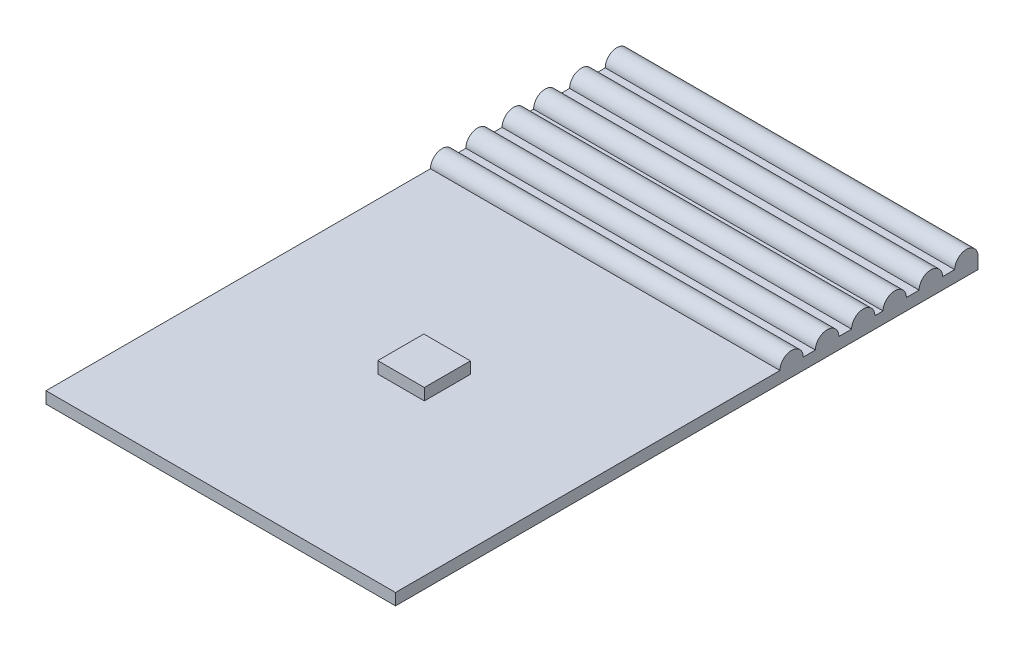
ISO-10303-21;
HEADER;
FILE_DESCRIPTION(('STEP AP214'),'2;1');
FILE_NAME('part.step','',(''),(''),'','','');
FILE_SCHEMA(('AUTOMOTIVE_DESIGN { 1 0 10303 214 1 1 1 1 }'));
ENDSEC;
DATA;
#1=APPLICATION_CONTEXT('core data for automotive mechanical design processes');
#2=APPLICATION_PROTOCOL_DEFINITION('international standard','automotive_design',2000,#1);
#3=PRODUCT_CONTEXT('',#1,'mechanical');
#4=PRODUCT('Part','Part','',(#3));
#5=PRODUCT_RELATED_PRODUCT_CATEGORY('part','',(#4));
#6=PRODUCT_DEFINITION_FORMATION('','',#4);
#7=PRODUCT_DEFINITION_CONTEXT('part definition',#1,'design');
#8=PRODUCT_DEFINITION('design','',#6,#7);
#9=PRODUCT_DEFINITION_SHAPE('','',#8);
#10=(LENGTH_UNIT() NAMED_UNIT(*) SI_UNIT(.MILLI.,.METRE.));
#11=(NAMED_UNIT(*) PLANE_ANGLE_UNIT() SI_UNIT($,.RADIAN.));
#12=(NAMED_UNIT(*) SI_UNIT($,.STERADIAN.) SOLID_ANGLE_UNIT());
#13=UNCERTAINTY_MEASURE_WITH_UNIT(LENGTH_MEASURE(1.E-05),#10,'distance_accuracy_value','');
#14=(GEOMETRIC_REPRESENTATION_CONTEXT(3) GLOBAL_UNCERTAINTY_ASSIGNED_CONTEXT((#13)) GLOBAL_UNIT_ASSIGNED_CONTEXT((#10,
#11,#12)) REPRESENTATION_CONTEXT('',''));
#15=CARTESIAN_POINT('',(0.,0.,0.));
#16=DIRECTION('',(0.,0.,1.));
#17=DIRECTION('',(1.,0.,0.));
#18=AXIS2_PLACEMENT_3D('',#15,#16,#17);
#19=CARTESIAN_POINT('',(0.,1.,0.));
#20=DIRECTION('',(0.,-1.,0.));
#21=DIRECTION('',(0.,0.,-1.));
#22=AXIS2_PLACEMENT_3D('',#19,#20,#21);
#23=PLANE('',#22);
#24=DIRECTION('',(-1.,0.,0.));
#25=VECTOR('',#24,1.);
#26=CARTESIAN_POINT('',(30.,1.,-33.));
#27=LINE('',#26,#25);
#28=CARTESIAN_POINT('',(30.,1.,-33.));
#29=VERTEX_POINT('',#28);
#30=CARTESIAN_POINT('',(0.,1.,-33.));
#31=VERTEX_POINT('',#30);
#32=EDGE_CURVE('E246',#29,#31,#27,.T.);
#33=ORIENTED_EDGE('',*,*,#32,.T.);
#34=DIRECTION('',(0.,0.,1.));
#35=VECTOR('',#34,1.);
#36=CARTESIAN_POINT('',(0.,1.,0.));
#37=LINE('',#36,#35);
#38=CARTESIAN_POINT('',(0.,1.,0.));
#39=VERTEX_POINT('',#38);
#40=EDGE_CURVE('E327',#31,#39,#37,.T.);
#41=ORIENTED_EDGE('',*,*,#40,.T.);
#42=DIRECTION('',(1.,0.,0.));
#43=VECTOR('',#42,1.);
#44=CARTESIAN_POINT('',(0.,1.,0.));
#45=LINE('',#44,#43);
#46=CARTESIAN_POINT('',(30.,1.,0.));
#47=VERTEX_POINT('',#46);
#48=EDGE_CURVE('E299',#39,#47,#45,.T.);
#49=ORIENTED_EDGE('',*,*,#48,.T.);
#50=DIRECTION('',(0.,0.,-1.));
#51=VECTOR('',#50,1.);
#52=CARTESIAN_POINT('',(30.,1.,0.));
#53=LINE('',#52,#51);
#54=EDGE_CURVE('E305',#47,#29,#53,.T.);
#55=ORIENTED_EDGE('',*,*,#54,.T.);
#56=EDGE_LOOP('',(#33,#41,#49,#55));
#57=FACE_BOUND('',#56,.T.);
#58=DIRECTION('',(0.,0.,1.));
#59=VECTOR('',#58,1.);
#60=CARTESIAN_POINT('',(13.,1.,-15.47647871836));
#61=LINE('',#60,#59);
#62=CARTESIAN_POINT('',(13.,1.,-19.4311612844648));
#63=VERTEX_POINT('',#62);
#64=CARTESIAN_POINT('',(13.,1.,-15.47647871836));
#65=VERTEX_POINT('',#64);
#66=EDGE_CURVE('E199',#63,#65,#61,.T.);
#67=ORIENTED_EDGE('',*,*,#66,.F.);
#68=DIRECTION('',(-1.,0.,0.));
#69=VECTOR('',#68,1.);
#70=CARTESIAN_POINT('',(13.,1.,-19.4311612844648));
#71=LINE('',#70,#69);
#72=CARTESIAN_POINT('',(17.,1.,-19.4311612844648));
#73=VERTEX_POINT('',#72);
#74=EDGE_CURVE('E196',#73,#63,#71,.T.);
#75=ORIENTED_EDGE('',*,*,#74,.F.);
#76=DIRECTION('',(0.,0.,-1.));
#77=VECTOR('',#76,1.);
#78=CARTESIAN_POINT('',(17.,1.,-15.47647871836));
#79=LINE('',#78,#77);
#80=CARTESIAN_POINT('',(17.,1.,-15.47647871836));
#81=VERTEX_POINT('',#80);
#82=EDGE_CURVE('E66',#81,#73,#79,.T.);
#83=ORIENTED_EDGE('',*,*,#82,.F.);
#84=DIRECTION('',(1.,0.,0.));
#85=VECTOR('',#84,1.);
#86=CARTESIAN_POINT('',(13.,1.,-15.47647871836));
#87=LINE('',#86,#85);
#88=EDGE_CURVE('E61',#65,#81,#87,.T.);
#89=ORIENTED_EDGE('',*,*,#88,.F.);
#90=EDGE_LOOP('',(#67,#75,#83,#89));
#91=FACE_BOUND('',#90,.T.);
#92=ADVANCED_FACE('F45',(#57,#91),#23,.F.);
#93=DIRECTION('',(-1.,0.,0.));
#94=VECTOR('',#93,1.);
#95=CARTESIAN_POINT('',(30.,1.,-39.1488586121635));
#96=LINE('',#95,#94);
#97=CARTESIAN_POINT('',(30.,1.,-39.1488586121635));
#98=VERTEX_POINT('',#97);
#99=CARTESIAN_POINT('',(0.,1.,-39.1488586121635));
#100=VERTEX_POINT('',#99);
#101=EDGE_CURVE('E216',#98,#100,#96,.T.);
#102=ORIENTED_EDGE('',*,*,#101,.T.);
#103=CARTESIAN_POINT('',(0.,1.,-38.053834368251));
#104=VERTEX_POINT('',#103);
#105=EDGE_CURVE('E301',#100,#104,#37,.T.);
#106=ORIENTED_EDGE('',*,*,#105,.T.);
#107=DIRECTION('',(-1.,0.,0.));
#108=VECTOR('',#107,1.);
#109=CARTESIAN_POINT('',(30.,1.,-38.053834368251));
#110=LINE('',#109,#108);
#111=CARTESIAN_POINT('',(30.,1.,-38.053834368251));
#112=VERTEX_POINT('',#111);
#113=EDGE_CURVE('E227',#112,#104,#110,.T.);
#114=ORIENTED_EDGE('',*,*,#113,.F.);
#115=EDGE_CURVE('E372',#112,#98,#53,.T.);
#116=ORIENTED_EDGE('',*,*,#115,.T.);
#117=EDGE_LOOP('',(#102,#106,#114,#116));
#118=FACE_BOUND('',#117,.T.);
#119=ADVANCED_FACE('F379',(#118),#23,.F.);
#120=DIRECTION('',(-1.,0.,0.));
#121=VECTOR('',#120,1.);
#122=CARTESIAN_POINT('',(30.,1.,-41.1488586121635));
#123=LINE('',#122,#121);
#124=CARTESIAN_POINT('',(30.,1.,-41.1488586121635));
#125=VERTEX_POINT('',#124);
#126=CARTESIAN_POINT('',(0.,1.,-41.1488586121635));
#127=VERTEX_POINT('',#126);
#128=EDGE_CURVE('E214',#125,#127,#123,.T.);
#129=ORIENTED_EDGE('',*,*,#128,.F.);
#130=CARTESIAN_POINT('',(30.,1.,-41.8511413878365));
#131=VERTEX_POINT('',#130);
#132=EDGE_CURVE('E310',#125,#131,#53,.T.);
#133=ORIENTED_EDGE('',*,*,#132,.T.);
#134=DIRECTION('',(-1.,0.,0.));
#135=VECTOR('',#134,1.);
#136=CARTESIAN_POINT('',(30.,1.,-41.8511413878365));
#137=LINE('',#136,#135);
#138=CARTESIAN_POINT('',(0.,1.,-41.8511413878365));
#139=VERTEX_POINT('',#138);
#140=EDGE_CURVE('E261',#131,#139,#137,.T.);
#141=ORIENTED_EDGE('',*,*,#140,.T.);
#142=EDGE_CURVE('E389',#139,#127,#37,.T.);
#143=ORIENTED_EDGE('',*,*,#142,.T.);
#144=EDGE_LOOP('',(#129,#133,#141,#143));
#145=FACE_BOUND('',#144,.T.);
#146=ADVANCED_FACE('F418',(#145),#23,.F.);
#147=DIRECTION('',(-1.,0.,0.));
#148=VECTOR('',#147,1.);
#149=CARTESIAN_POINT('',(30.,1.,-36.0394325529336));
#150=LINE('',#149,#148);
#151=CARTESIAN_POINT('',(30.,1.,-36.0394325529336));
#152=VERTEX_POINT('',#151);
#153=CARTESIAN_POINT('',(0.,1.,-36.0394325529336));
#154=VERTEX_POINT('',#153);
#155=EDGE_CURVE('E231',#152,#154,#150,.T.);
#156=ORIENTED_EDGE('',*,*,#155,.T.);
#157=CARTESIAN_POINT('',(0.,1.,-35.));
#158=VERTEX_POINT('',#157);
#159=EDGE_CURVE('E394',#154,#158,#37,.T.);
#160=ORIENTED_EDGE('',*,*,#159,.T.);
#161=DIRECTION('',(-1.,0.,0.));
#162=VECTOR('',#161,1.);
#163=CARTESIAN_POINT('',(30.,1.,-35.));
#164=LINE('',#163,#162);
#165=CARTESIAN_POINT('',(30.,1.,-35.));
#166=VERTEX_POINT('',#165);
#167=EDGE_CURVE('E242',#166,#158,#164,.T.);
#168=ORIENTED_EDGE('',*,*,#167,.F.);
#169=EDGE_CURVE('E309',#166,#152,#53,.T.);
#170=ORIENTED_EDGE('',*,*,#169,.T.);
#171=EDGE_LOOP('',(#156,#160,#168,#170));
#172=FACE_BOUND('',#171,.T.);
#173=ADVANCED_FACE('F429',(#172),#23,.F.);
#174=CARTESIAN_POINT('',(0.,1.,-44.946165631749));
#175=VERTEX_POINT('',#174);
#176=CARTESIAN_POINT('',(0.,1.,-43.8511413878365));
#177=VERTEX_POINT('',#176);
#178=EDGE_CURVE('E300',#175,#177,#37,.T.);
#179=ORIENTED_EDGE('',*,*,#178,.T.);
#180=DIRECTION('',(-1.,0.,0.));
#181=VECTOR('',#180,1.);
#182=CARTESIAN_POINT('',(30.,1.,-43.8511413878365));
#183=LINE('',#182,#181);
#184=CARTESIAN_POINT('',(30.,1.,-43.8511413878365));
#185=VERTEX_POINT('',#184);
#186=EDGE_CURVE('E257',#185,#177,#183,.T.);
#187=ORIENTED_EDGE('',*,*,#186,.F.);
#188=CARTESIAN_POINT('',(30.,1.,-44.946165631749));
#189=VERTEX_POINT('',#188);
#190=EDGE_CURVE('E361',#185,#189,#53,.T.);
#191=ORIENTED_EDGE('',*,*,#190,.T.);
#192=DIRECTION('',(-1.,0.,0.));
#193=VECTOR('',#192,1.);
#194=CARTESIAN_POINT('',(30.,1.,-44.946165631749));
#195=LINE('',#194,#193);
#196=EDGE_CURVE('E276',#189,#175,#195,.T.);
#197=ORIENTED_EDGE('',*,*,#196,.T.);
#198=EDGE_LOOP('',(#179,#187,#191,#197));
#199=FACE_BOUND('',#198,.T.);
#200=ADVANCED_FACE('F367',(#199),#23,.F.);
#201=CARTESIAN_POINT('',(0.,1.,0.));
#202=DIRECTION('',(1.,0.,0.));
#203=DIRECTION('',(0.,0.,-1.));
#204=AXIS2_PLACEMENT_3D('',#201,#202,#203);
#205=PLANE('',#204);
#206=DIRECTION('',(0.,0.,1.));
#207=VECTOR('',#206,1.);
#208=CARTESIAN_POINT('',(0.,0.,0.));
#209=LINE('',#208,#207);
#210=CARTESIAN_POINT('',(0.,0.,-50.));
#211=VERTEX_POINT('',#210);
#212=CARTESIAN_POINT('',(0.,0.,0.));
#213=VERTEX_POINT('',#212);
#214=EDGE_CURVE('E295',#211,#213,#209,.T.);
#215=ORIENTED_EDGE('',*,*,#214,.T.);
#216=DIRECTION('',(0.,-1.,0.));
#217=VECTOR('',#216,1.);
#218=CARTESIAN_POINT('',(0.,1.,0.));
#219=LINE('',#218,#217);
#220=EDGE_CURVE('E11',#39,#213,#219,.T.);
#221=ORIENTED_EDGE('',*,*,#220,.F.);
#222=ORIENTED_EDGE('',*,*,#40,.F.);
#223=CARTESIAN_POINT('',(0.,1.,-34.));
#224=DIRECTION('',(1.,0.,0.));
#225=DIRECTION('',(0.,0.,-1.));
#226=AXIS2_PLACEMENT_3D('',#223,#224,#225);
#227=CIRCLE('',#226,1.);
#228=EDGE_CURVE('E234',#158,#31,#227,.T.);
#229=ORIENTED_EDGE('',*,*,#228,.F.);
#230=ORIENTED_EDGE('',*,*,#159,.F.);
#231=CARTESIAN_POINT('',(0.,1.,-37.0466334605923));
#232=DIRECTION('',(1.,0.,0.));
#233=DIRECTION('',(0.,0.,-1.));
#234=AXIS2_PLACEMENT_3D('',#231,#232,#233);
#235=CIRCLE('',#234,1.00720090765871);
#236=EDGE_CURVE('E219',#104,#154,#235,.T.);
#237=ORIENTED_EDGE('',*,*,#236,.F.);
#238=ORIENTED_EDGE('',*,*,#105,.F.);
#239=CARTESIAN_POINT('',(0.,1.,-40.1488586121635));
#240=DIRECTION('',(1.,0.,0.));
#241=DIRECTION('',(0.,0.,-1.));
#242=AXIS2_PLACEMENT_3D('',#239,#240,#241);
#243=CIRCLE('',#242,1.);
#244=EDGE_CURVE('E201',#127,#100,#243,.T.);
#245=ORIENTED_EDGE('',*,*,#244,.F.);
#246=ORIENTED_EDGE('',*,*,#142,.F.);
#247=CARTESIAN_POINT('',(0.,1.,-42.8511413878365));
#248=DIRECTION('',(-1.,0.,0.));
#249=DIRECTION('',(0.,0.,1.));
#250=AXIS2_PLACEMENT_3D('',#247,#248,#249);
#251=CIRCLE('',#250,1.);
#252=EDGE_CURVE('E249',#139,#177,#251,.T.);
#253=ORIENTED_EDGE('',*,*,#252,.T.);
#254=ORIENTED_EDGE('',*,*,#178,.F.);
#255=CARTESIAN_POINT('',(0.,1.,-45.9533665394077));
#256=DIRECTION('',(-1.,0.,0.));
#257=DIRECTION('',(0.,0.,1.));
#258=AXIS2_PLACEMENT_3D('',#255,#256,#257);
#259=CIRCLE('',#258,1.00720090765871);
#260=CARTESIAN_POINT('',(0.,1.,-46.9605674470664));
#261=VERTEX_POINT('',#260);
#262=EDGE_CURVE('E264',#175,#261,#259,.T.);
#263=ORIENTED_EDGE('',*,*,#262,.T.);
#264=CARTESIAN_POINT('',(0.,1.,-48.));
#265=VERTEX_POINT('',#264);
#266=EDGE_CURVE('E296',#265,#261,#37,.T.);
#267=ORIENTED_EDGE('',*,*,#266,.F.);
#268=CARTESIAN_POINT('',(0.,1.,-49.));
#269=DIRECTION('',(-1.,0.,0.));
#270=DIRECTION('',(0.,0.,1.));
#271=AXIS2_PLACEMENT_3D('',#268,#269,#270);
#272=CIRCLE('',#271,1.);
#273=CARTESIAN_POINT('',(0.,1.,-50.));
#274=VERTEX_POINT('',#273);
#275=EDGE_CURVE('E280',#265,#274,#272,.T.);
#276=ORIENTED_EDGE('',*,*,#275,.T.);
#277=DIRECTION('',(0.,-1.,0.));
#278=VECTOR('',#277,1.);
#279=CARTESIAN_POINT('',(0.,1.,-50.));
#280=LINE('',#279,#278);
#281=EDGE_CURVE('E314',#274,#211,#280,.T.);
#282=ORIENTED_EDGE('',*,*,#281,.T.);
#283=EDGE_LOOP('',(#215,#221,#222,#229,#230,#237,#238,#245,#246,#253,#254,#263,#267,#276,#282));
#284=FACE_BOUND('',#283,.T.);
#285=ADVANCED_FACE('F47',(#284),#205,.F.);
#286=CARTESIAN_POINT('',(0.,1.,0.));
#287=DIRECTION('',(0.,0.,-1.));
#288=DIRECTION('',(-1.,0.,0.));
#289=AXIS2_PLACEMENT_3D('',#286,#287,#288);
#290=PLANE('',#289);
#291=DIRECTION('',(1.,0.,0.));
#292=VECTOR('',#291,1.);
#293=CARTESIAN_POINT('',(0.,0.,0.));
#294=LINE('',#293,#292);
#295=CARTESIAN_POINT('',(30.,0.,0.));
#296=VERTEX_POINT('',#295);
#297=EDGE_CURVE('E318',#213,#296,#294,.T.);
#298=ORIENTED_EDGE('',*,*,#297,.T.);
#299=DIRECTION('',(0.,-1.,0.));
#300=VECTOR('',#299,1.);
#301=CARTESIAN_POINT('',(30.,1.,0.));
#302=LINE('',#301,#300);
#303=EDGE_CURVE('E54',#47,#296,#302,.T.);
#304=ORIENTED_EDGE('',*,*,#303,.F.);
#305=ORIENTED_EDGE('',*,*,#48,.F.);
#306=ORIENTED_EDGE('',*,*,#220,.T.);
#307=EDGE_LOOP('',(#298,#304,#305,#306));
#308=FACE_BOUND('',#307,.T.);
#309=ADVANCED_FACE('F402',(#308),#290,.F.);
#310=CARTESIAN_POINT('',(30.,1.,0.));
#311=DIRECTION('',(-1.,0.,0.));
#312=DIRECTION('',(0.,0.,1.));
#313=AXIS2_PLACEMENT_3D('',#310,#311,#312);
#314=PLANE('',#313);
#315=DIRECTION('',(0.,0.,-1.));
#316=VECTOR('',#315,1.);
#317=CARTESIAN_POINT('',(30.,0.,0.));
#318=LINE('',#317,#316);
#319=CARTESIAN_POINT('',(30.,0.,-50.));
#320=VERTEX_POINT('',#319);
#321=EDGE_CURVE('E321',#296,#320,#318,.T.);
#322=ORIENTED_EDGE('',*,*,#321,.T.);
#323=DIRECTION('',(0.,-1.,0.));
#324=VECTOR('',#323,1.);
#325=CARTESIAN_POINT('',(30.,1.,-50.));
#326=LINE('',#325,#324);
#327=CARTESIAN_POINT('',(30.,1.,-50.));
#328=VERTEX_POINT('',#327);
#329=EDGE_CURVE('E331',#328,#320,#326,.T.);
#330=ORIENTED_EDGE('',*,*,#329,.F.);
#331=CARTESIAN_POINT('',(30.,1.,-49.));
#332=DIRECTION('',(-1.,0.,0.));
#333=DIRECTION('',(0.,0.,1.));
#334=AXIS2_PLACEMENT_3D('',#331,#332,#333);
#335=CIRCLE('',#334,1.);
#336=CARTESIAN_POINT('',(30.,1.,-48.));
#337=VERTEX_POINT('',#336);
#338=EDGE_CURVE('E284',#337,#328,#335,.T.);
#339=ORIENTED_EDGE('',*,*,#338,.F.);
#340=CARTESIAN_POINT('',(30.,1.,-46.9605674470664));
#341=VERTEX_POINT('',#340);
#342=EDGE_CURVE('E304',#341,#337,#53,.T.);
#343=ORIENTED_EDGE('',*,*,#342,.F.);
#344=CARTESIAN_POINT('',(30.,1.,-45.9533665394077));
#345=DIRECTION('',(-1.,0.,0.));
#346=DIRECTION('',(0.,0.,1.));
#347=AXIS2_PLACEMENT_3D('',#344,#345,#346);
#348=CIRCLE('',#347,1.00720090765871);
#349=EDGE_CURVE('E268',#189,#341,#348,.T.);
#350=ORIENTED_EDGE('',*,*,#349,.F.);
#351=ORIENTED_EDGE('',*,*,#190,.F.);
#352=CARTESIAN_POINT('',(30.,1.,-42.8511413878365));
#353=DIRECTION('',(-1.,0.,0.));
#354=DIRECTION('',(0.,0.,1.));
#355=AXIS2_PLACEMENT_3D('',#352,#353,#354);
#356=CIRCLE('',#355,1.);
#357=EDGE_CURVE('E253',#131,#185,#356,.T.);
#358=ORIENTED_EDGE('',*,*,#357,.F.);
#359=ORIENTED_EDGE('',*,*,#132,.F.);
#360=CARTESIAN_POINT('',(30.,1.,-40.1488586121635));
#361=DIRECTION('',(1.,0.,0.));
#362=DIRECTION('',(0.,0.,-1.));
#363=AXIS2_PLACEMENT_3D('',#360,#361,#362);
#364=CIRCLE('',#363,1.);
#365=EDGE_CURVE('E206',#125,#98,#364,.T.);
#366=ORIENTED_EDGE('',*,*,#365,.T.);
#367=ORIENTED_EDGE('',*,*,#115,.F.);
#368=CARTESIAN_POINT('',(30.,1.,-37.0466334605923));
#369=DIRECTION('',(1.,0.,0.));
#370=DIRECTION('',(0.,0.,-1.));
#371=AXIS2_PLACEMENT_3D('',#368,#369,#370);
#372=CIRCLE('',#371,1.00720090765871);
#373=EDGE_CURVE('E223',#112,#152,#372,.T.);
#374=ORIENTED_EDGE('',*,*,#373,.T.);
#375=ORIENTED_EDGE('',*,*,#169,.F.);
#376=CARTESIAN_POINT('',(30.,1.,-34.));
#377=DIRECTION('',(1.,0.,0.));
#378=DIRECTION('',(0.,0.,-1.));
#379=AXIS2_PLACEMENT_3D('',#376,#377,#378);
#380=CIRCLE('',#379,1.);
#381=EDGE_CURVE('E238',#166,#29,#380,.T.);
#382=ORIENTED_EDGE('',*,*,#381,.T.);
#383=ORIENTED_EDGE('',*,*,#54,.F.);
#384=ORIENTED_EDGE('',*,*,#303,.T.);
#385=EDGE_LOOP('',(#322,#330,#339,#343,#350,#351,#358,#359,#366,#367,#374,#375,#382,#383,#384));
#386=FACE_BOUND('',#385,.T.);
#387=ADVANCED_FACE('F340',(#386),#314,.F.);
#388=CARTESIAN_POINT('',(0.,1.,-50.));
#389=DIRECTION('',(0.,0.,1.));
#390=DIRECTION('',(1.,0.,0.));
#391=AXIS2_PLACEMENT_3D('',#388,#389,#390);
#392=PLANE('',#391);
#393=DIRECTION('',(-1.,0.,0.));
#394=VECTOR('',#393,1.);
#395=CARTESIAN_POINT('',(0.,0.,-50.));
#396=LINE('',#395,#394);
#397=EDGE_CURVE('E324',#320,#211,#396,.T.);
#398=ORIENTED_EDGE('',*,*,#397,.T.);
#399=ORIENTED_EDGE('',*,*,#281,.F.);
#400=DIRECTION('',(-1.,0.,0.));
#401=VECTOR('',#400,1.);
#402=CARTESIAN_POINT('',(0.,1.,-50.));
#403=LINE('',#402,#401);
#404=EDGE_CURVE('E308',#328,#274,#403,.T.);
#405=ORIENTED_EDGE('',*,*,#404,.F.);
#406=ORIENTED_EDGE('',*,*,#329,.T.);
#407=EDGE_LOOP('',(#398,#399,#405,#406));
#408=FACE_BOUND('',#407,.T.);
#409=ADVANCED_FACE('F348',(#408),#392,.F.);
#410=ORIENTED_EDGE('',*,*,#266,.T.);
#411=DIRECTION('',(-1.,0.,0.));
#412=VECTOR('',#411,1.);
#413=CARTESIAN_POINT('',(30.,1.,-46.9605674470664));
#414=LINE('',#413,#412);
#415=EDGE_CURVE('E272',#341,#261,#414,.T.);
#416=ORIENTED_EDGE('',*,*,#415,.F.);
#417=ORIENTED_EDGE('',*,*,#342,.T.);
#418=DIRECTION('',(-1.,0.,0.));
#419=VECTOR('',#418,1.);
#420=CARTESIAN_POINT('',(30.,1.,-48.));
#421=LINE('',#420,#419);
#422=EDGE_CURVE('E288',#337,#265,#421,.T.);
#423=ORIENTED_EDGE('',*,*,#422,.T.);
#424=EDGE_LOOP('',(#410,#416,#417,#423));
#425=FACE_BOUND('',#424,.T.);
#426=ADVANCED_FACE('F412',(#425),#23,.F.);
#427=CARTESIAN_POINT('',(0.,0.,0.));
#428=DIRECTION('',(0.,-1.,0.));
#429=DIRECTION('',(0.,0.,-1.));
#430=AXIS2_PLACEMENT_3D('',#427,#428,#429);
#431=PLANE('',#430);
#432=ORIENTED_EDGE('',*,*,#214,.F.);
#433=ORIENTED_EDGE('',*,*,#397,.F.);
#434=ORIENTED_EDGE('',*,*,#321,.F.);
#435=ORIENTED_EDGE('',*,*,#297,.F.);
#436=EDGE_LOOP('',(#432,#433,#434,#435));
#437=FACE_BOUND('',#436,.T.);
#438=ADVANCED_FACE('F346',(#437),#431,.T.);
#439=CARTESIAN_POINT('',(30.,1.,-49.));
#440=DIRECTION('',(-1.,0.,0.));
#441=DIRECTION('',(0.,0.,1.));
#442=AXIS2_PLACEMENT_3D('',#439,#440,#441);
#443=CYLINDRICAL_SURFACE('',#442,1.);
#444=ORIENTED_EDGE('',*,*,#275,.F.);
#445=ORIENTED_EDGE('',*,*,#422,.F.);
#446=ORIENTED_EDGE('',*,*,#338,.T.);
#447=ORIENTED_EDGE('',*,*,#404,.T.);
#448=EDGE_LOOP('',(#444,#445,#446,#447));
#449=FACE_BOUND('',#448,.T.);
#450=ADVANCED_FACE('F355',(#449),#443,.T.);
#451=CARTESIAN_POINT('',(30.,1.,-45.9533665394077));
#452=DIRECTION('',(-1.,0.,0.));
#453=DIRECTION('',(0.,0.,1.));
#454=AXIS2_PLACEMENT_3D('',#451,#452,#453);
#455=CYLINDRICAL_SURFACE('',#454,1.00720090765871);
#456=ORIENTED_EDGE('',*,*,#262,.F.);
#457=ORIENTED_EDGE('',*,*,#196,.F.);
#458=ORIENTED_EDGE('',*,*,#349,.T.);
#459=ORIENTED_EDGE('',*,*,#415,.T.);
#460=EDGE_LOOP('',(#456,#457,#458,#459));
#461=FACE_BOUND('',#460,.T.);
#462=ADVANCED_FACE('F365',(#461),#455,.T.);
#463=CARTESIAN_POINT('',(30.,1.,-42.8511413878365));
#464=DIRECTION('',(-1.,0.,0.));
#465=DIRECTION('',(0.,0.,1.));
#466=AXIS2_PLACEMENT_3D('',#463,#464,#465);
#467=CYLINDRICAL_SURFACE('',#466,1.);
#468=ORIENTED_EDGE('',*,*,#252,.F.);
#469=ORIENTED_EDGE('',*,*,#140,.F.);
#470=ORIENTED_EDGE('',*,*,#357,.T.);
#471=ORIENTED_EDGE('',*,*,#186,.T.);
#472=EDGE_LOOP('',(#468,#469,#470,#471));
#473=FACE_BOUND('',#472,.T.);
#474=ADVANCED_FACE('F445',(#473),#467,.T.);
#475=CARTESIAN_POINT('',(30.,1.,-34.));
#476=DIRECTION('',(-1.,0.,0.));
#477=DIRECTION('',(0.,0.,1.));
#478=AXIS2_PLACEMENT_3D('',#475,#476,#477);
#479=CYLINDRICAL_SURFACE('',#478,1.);
#480=ORIENTED_EDGE('',*,*,#228,.T.);
#481=ORIENTED_EDGE('',*,*,#32,.F.);
#482=ORIENTED_EDGE('',*,*,#381,.F.);
#483=ORIENTED_EDGE('',*,*,#167,.T.);
#484=EDGE_LOOP('',(#480,#481,#482,#483));
#485=FACE_BOUND('',#484,.T.);
#486=ADVANCED_FACE('F443',(#485),#479,.T.);
#487=CARTESIAN_POINT('',(30.,1.,-37.0466334605923));
#488=DIRECTION('',(-1.,0.,0.));
#489=DIRECTION('',(0.,0.,1.));
#490=AXIS2_PLACEMENT_3D('',#487,#488,#489);
#491=CYLINDRICAL_SURFACE('',#490,1.00720090765871);
#492=ORIENTED_EDGE('',*,*,#236,.T.);
#493=ORIENTED_EDGE('',*,*,#155,.F.);
#494=ORIENTED_EDGE('',*,*,#373,.F.);
#495=ORIENTED_EDGE('',*,*,#113,.T.);
#496=EDGE_LOOP('',(#492,#493,#494,#495));
#497=FACE_BOUND('',#496,.T.);
#498=ADVANCED_FACE('F440',(#497),#491,.T.);
#499=CARTESIAN_POINT('',(30.,1.,-40.1488586121635));
#500=DIRECTION('',(-1.,0.,0.));
#501=DIRECTION('',(0.,0.,1.));
#502=AXIS2_PLACEMENT_3D('',#499,#500,#501);
#503=CYLINDRICAL_SURFACE('',#502,1.);
#504=ORIENTED_EDGE('',*,*,#244,.T.);
#505=ORIENTED_EDGE('',*,*,#101,.F.);
#506=ORIENTED_EDGE('',*,*,#365,.F.);
#507=ORIENTED_EDGE('',*,*,#128,.T.);
#508=EDGE_LOOP('',(#504,#505,#506,#507));
#509=FACE_BOUND('',#508,.T.);
#510=ADVANCED_FACE('F386',(#509),#503,.T.);
#511=CARTESIAN_POINT('',(13.,2.,-15.47647871836));
#512=DIRECTION('',(1.,0.,0.));
#513=DIRECTION('',(0.,0.,-1.));
#514=AXIS2_PLACEMENT_3D('',#511,#512,#513);
#515=PLANE('',#514);
#516=ORIENTED_EDGE('',*,*,#66,.T.);
#517=DIRECTION('',(0.,-1.,0.));
#518=VECTOR('',#517,1.);
#519=CARTESIAN_POINT('',(13.,2.,-15.47647871836));
#520=LINE('',#519,#518);
#521=CARTESIAN_POINT('',(13.,2.,-15.47647871836));
#522=VERTEX_POINT('',#521);
#523=EDGE_CURVE('E178',#522,#65,#520,.T.);
#524=ORIENTED_EDGE('',*,*,#523,.F.);
#525=DIRECTION('',(0.,0.,1.));
#526=VECTOR('',#525,1.);
#527=CARTESIAN_POINT('',(13.,2.,-15.47647871836));
#528=LINE('',#527,#526);
#529=CARTESIAN_POINT('',(13.,2.,-19.4311612844648));
#530=VERTEX_POINT('',#529);
#531=EDGE_CURVE('E186',#530,#522,#528,.T.);
#532=ORIENTED_EDGE('',*,*,#531,.F.);
#533=DIRECTION('',(0.,-1.,0.));
#534=VECTOR('',#533,1.);
#535=CARTESIAN_POINT('',(13.,2.,-19.4311612844648));
#536=LINE('',#535,#534);
#537=EDGE_CURVE('E604',#530,#63,#536,.T.);
#538=ORIENTED_EDGE('',*,*,#537,.T.);
#539=EDGE_LOOP('',(#516,#524,#532,#538));
#540=FACE_BOUND('',#539,.T.);
#541=ADVANCED_FACE('F198',(#540),#515,.F.);
#542=CARTESIAN_POINT('',(13.,2.,-15.47647871836));
#543=DIRECTION('',(0.,0.,-1.));
#544=DIRECTION('',(-1.,0.,0.));
#545=AXIS2_PLACEMENT_3D('',#542,#543,#544);
#546=PLANE('',#545);
#547=ORIENTED_EDGE('',*,*,#88,.T.);
#548=DIRECTION('',(0.,-1.,0.));
#549=VECTOR('',#548,1.);
#550=CARTESIAN_POINT('',(17.,2.,-15.47647871836));
#551=LINE('',#550,#549);
#552=CARTESIAN_POINT('',(17.,2.,-15.47647871836));
#553=VERTEX_POINT('',#552);
#554=EDGE_CURVE('E181',#553,#81,#551,.T.);
#555=ORIENTED_EDGE('',*,*,#554,.F.);
#556=DIRECTION('',(1.,0.,0.));
#557=VECTOR('',#556,1.);
#558=CARTESIAN_POINT('',(13.,2.,-15.47647871836));
#559=LINE('',#558,#557);
#560=EDGE_CURVE('E174',#522,#553,#559,.T.);
#561=ORIENTED_EDGE('',*,*,#560,.F.);
#562=ORIENTED_EDGE('',*,*,#523,.T.);
#563=EDGE_LOOP('',(#547,#555,#561,#562));
#564=FACE_BOUND('',#563,.T.);
#565=ADVANCED_FACE('F176',(#564),#546,.F.);
#566=CARTESIAN_POINT('',(17.,2.,-15.47647871836));
#567=DIRECTION('',(-1.,0.,0.));
#568=DIRECTION('',(0.,0.,1.));
#569=AXIS2_PLACEMENT_3D('',#566,#567,#568);
#570=PLANE('',#569);
#571=ORIENTED_EDGE('',*,*,#82,.T.);
#572=DIRECTION('',(0.,-1.,0.));
#573=VECTOR('',#572,1.);
#574=CARTESIAN_POINT('',(17.,2.,-19.4311612844648));
#575=LINE('',#574,#573);
#576=CARTESIAN_POINT('',(17.,2.,-19.4311612844648));
#577=VERTEX_POINT('',#576);
#578=EDGE_CURVE('E208',#577,#73,#575,.T.);
#579=ORIENTED_EDGE('',*,*,#578,.F.);
#580=DIRECTION('',(0.,0.,-1.));
#581=VECTOR('',#580,1.);
#582=CARTESIAN_POINT('',(17.,2.,-15.47647871836));
#583=LINE('',#582,#581);
#584=EDGE_CURVE('E185',#553,#577,#583,.T.);
#585=ORIENTED_EDGE('',*,*,#584,.F.);
#586=ORIENTED_EDGE('',*,*,#554,.T.);
#587=EDGE_LOOP('',(#571,#579,#585,#586));
#588=FACE_BOUND('',#587,.T.);
#589=ADVANCED_FACE('F570',(#588),#570,.F.);
#590=CARTESIAN_POINT('',(13.,2.,-19.4311612844648));
#591=DIRECTION('',(0.,0.,1.));
#592=DIRECTION('',(1.,0.,0.));
#593=AXIS2_PLACEMENT_3D('',#590,#591,#592);
#594=PLANE('',#593);
#595=ORIENTED_EDGE('',*,*,#74,.T.);
#596=ORIENTED_EDGE('',*,*,#537,.F.);
#597=DIRECTION('',(-1.,0.,0.));
#598=VECTOR('',#597,1.);
#599=CARTESIAN_POINT('',(13.,2.,-19.4311612844648));
#600=LINE('',#599,#598);
#601=EDGE_CURVE('E191',#577,#530,#600,.T.);
#602=ORIENTED_EDGE('',*,*,#601,.F.);
#603=ORIENTED_EDGE('',*,*,#578,.T.);
#604=EDGE_LOOP('',(#595,#596,#602,#603));
#605=FACE_BOUND('',#604,.T.);
#606=ADVANCED_FACE('F578',(#605),#594,.F.);
#607=CARTESIAN_POINT('',(0.,2.,0.));
#608=DIRECTION('',(0.,-1.,0.));
#609=DIRECTION('',(0.,0.,-1.));
#610=AXIS2_PLACEMENT_3D('',#607,#608,#609);
#611=PLANE('',#610);
#612=ORIENTED_EDGE('',*,*,#531,.T.);
#613=ORIENTED_EDGE('',*,*,#560,.T.);
#614=ORIENTED_EDGE('',*,*,#584,.T.);
#615=ORIENTED_EDGE('',*,*,#601,.T.);
#616=EDGE_LOOP('',(#612,#613,#614,#615));
#617=FACE_BOUND('',#616,.T.);
#618=ADVANCED_FACE('F189',(#617),#611,.F.);
#619=CLOSED_SHELL('',(#92,#119,#146,#173,#200,#285,#309,#387,#409,#426,#438,#450,#462,#474,#486,
#498,#510,#541,#565,#589,#606,#618));
#620=MANIFOLD_SOLID_BREP('B2',#619);
#621=ADVANCED_BREP_SHAPE_REPRESENTATION('',(#18,#620),#14);
#622=SHAPE_DEFINITION_REPRESENTATION(#9,#621);
ENDSEC;
END-ISO-10303-21;
